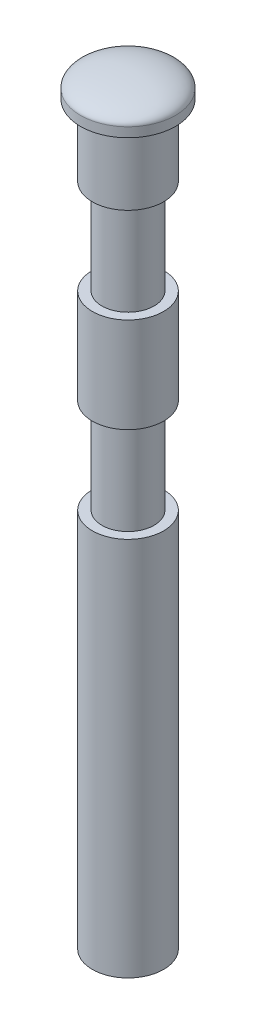
ISO-10303-21;
HEADER;
FILE_DESCRIPTION(('STEP AP214'),'2;1');
FILE_NAME('part.step','',(''),(''),'','','');
FILE_SCHEMA(('AUTOMOTIVE_DESIGN { 1 0 10303 214 1 1 1 1 }'));
ENDSEC;
DATA;
#1=APPLICATION_CONTEXT('core data for automotive mechanical design processes');
#2=APPLICATION_PROTOCOL_DEFINITION('international standard','automotive_design',2000,#1);
#3=PRODUCT_CONTEXT('',#1,'mechanical');
#4=PRODUCT('Part','Part','',(#3));
#5=PRODUCT_RELATED_PRODUCT_CATEGORY('part','',(#4));
#6=PRODUCT_DEFINITION_FORMATION('','',#4);
#7=PRODUCT_DEFINITION_CONTEXT('part definition',#1,'design');
#8=PRODUCT_DEFINITION('design','',#6,#7);
#9=PRODUCT_DEFINITION_SHAPE('','',#8);
#10=(LENGTH_UNIT() NAMED_UNIT(*) SI_UNIT(.MILLI.,.METRE.));
#11=(NAMED_UNIT(*) PLANE_ANGLE_UNIT() SI_UNIT($,.RADIAN.));
#12=(NAMED_UNIT(*) SI_UNIT($,.STERADIAN.) SOLID_ANGLE_UNIT());
#13=UNCERTAINTY_MEASURE_WITH_UNIT(LENGTH_MEASURE(1.E-05),#10,'distance_accuracy_value','');
#14=(GEOMETRIC_REPRESENTATION_CONTEXT(3) GLOBAL_UNCERTAINTY_ASSIGNED_CONTEXT((#13)) GLOBAL_UNIT_ASSIGNED_CONTEXT((#10,
#11,#12)) REPRESENTATION_CONTEXT('',''));
#15=CARTESIAN_POINT('',(0.,0.,0.));
#16=DIRECTION('',(0.,0.,1.));
#17=DIRECTION('',(1.,0.,0.));
#18=AXIS2_PLACEMENT_3D('',#15,#16,#17);
#19=CARTESIAN_POINT('',(0.999999999999998,22.0106613384872,0.));
#20=DIRECTION('',(0.,1.,0.));
#21=DIRECTION('',(-1.,0.,0.));
#22=AXIS2_PLACEMENT_3D('',#19,#20,#21);
#23=CYLINDRICAL_SURFACE('',#22,1.);
#24=CARTESIAN_POINT('',(0.999999999999999,15.7,0.));
#25=DIRECTION('',(0.,1.,0.));
#26=DIRECTION('',(-1.,0.,0.));
#27=AXIS2_PLACEMENT_3D('',#24,#25,#26);
#28=CIRCLE('',#27,1.);
#29=CARTESIAN_POINT('',(0.,15.7,0.));
#30=VERTEX_POINT('',#29);
#31=EDGE_CURVE('E11',#30,#30,#28,.T.);
#32=ORIENTED_EDGE('',*,*,#31,.F.);
#33=EDGE_LOOP('',(#32));
#34=FACE_BOUND('',#33,.T.);
#35=CARTESIAN_POINT('',(0.999999999999999,15.5,0.));
#36=DIRECTION('',(0.,-1.,0.));
#37=DIRECTION('',(1.,0.,0.));
#38=AXIS2_PLACEMENT_3D('',#35,#36,#37);
#39=CIRCLE('',#38,1.);
#40=CARTESIAN_POINT('',(2.,15.5,0.));
#41=VERTEX_POINT('',#40);
#42=EDGE_CURVE('E42',#41,#41,#39,.T.);
#43=ORIENTED_EDGE('',*,*,#42,.F.);
#44=EDGE_LOOP('',(#43));
#45=FACE_BOUND('',#44,.T.);
#46=ADVANCED_FACE('F35',(#34,#45),#23,.T.);
#47=CARTESIAN_POINT('',(1.,15.7,0.));
#48=DIRECTION('',(0.,0.,1.));
#49=DIRECTION('',(1.,0.,0.));
#50=AXIS2_PLACEMENT_3D('',#47,#48,#49);
#51=ELLIPSE('',#50,1.,0.300000000000002);
#52=TRIMMED_CURVE('',#51,(PARAMETER_VALUE(-1.5707963267949)),(PARAMETER_VALUE(1.5707963267949)),
.T.,.PARAMETER.);
#53=CARTESIAN_POINT('',(0.999999999999998,22.0106613384872,0.));
#54=DIRECTION('',(0.,1.,0.));
#55=AXIS1_PLACEMENT('',#53,#54);
#56=SURFACE_OF_REVOLUTION('',#52,#55);
#57=CARTESIAN_POINT('',(0.999999999999999,16.,0.));
#58=VERTEX_POINT('',#57);
#59=VERTEX_LOOP('',#58);
#60=FACE_BOUND('',#59,.T.);
#61=ORIENTED_EDGE('',*,*,#31,.T.);
#62=EDGE_LOOP('',(#61));
#63=FACE_BOUND('',#62,.T.);
#64=ADVANCED_FACE('F46',(#60,#63),#56,.T.);
#65=CARTESIAN_POINT('',(0.999999999999999,15.5,0.));
#66=DIRECTION('',(0.,-1.,0.));
#67=DIRECTION('',(1.,0.,0.));
#68=AXIS2_PLACEMENT_3D('',#65,#66,#67);
#69=PLANE('',#68);
#70=CARTESIAN_POINT('',(0.999999999999999,15.5,0.));
#71=DIRECTION('',(0.,-1.,0.));
#72=DIRECTION('',(1.,0.,0.));
#73=AXIS2_PLACEMENT_3D('',#70,#71,#72);
#74=CIRCLE('',#73,0.75);
#75=CARTESIAN_POINT('',(1.75,15.5,0.));
#76=VERTEX_POINT('',#75);
#77=EDGE_CURVE('E57',#76,#76,#74,.T.);
#78=ORIENTED_EDGE('',*,*,#77,.F.);
#79=EDGE_LOOP('',(#78));
#80=FACE_BOUND('',#79,.T.);
#81=ORIENTED_EDGE('',*,*,#42,.T.);
#82=EDGE_LOOP('',(#81));
#83=FACE_BOUND('',#82,.T.);
#84=ADVANCED_FACE('F49',(#80,#83),#69,.T.);
#85=CARTESIAN_POINT('',(0.999999999999999,15.5,0.));
#86=DIRECTION('',(0.,-1.,0.));
#87=DIRECTION('',(1.,0.,0.));
#88=AXIS2_PLACEMENT_3D('',#85,#86,#87);
#89=CYLINDRICAL_SURFACE('',#88,0.75);
#90=CARTESIAN_POINT('',(0.999999999999999,14.,0.));
#91=DIRECTION('',(0.,1.,0.));
#92=DIRECTION('',(0.,0.,1.));
#93=AXIS2_PLACEMENT_3D('',#90,#91,#92);
#94=CIRCLE('',#93,0.75);
#95=CARTESIAN_POINT('',(0.999999999999999,14.,0.75));
#96=VERTEX_POINT('',#95);
#97=EDGE_CURVE('E70',#96,#96,#94,.F.);
#98=ORIENTED_EDGE('',*,*,#97,.F.);
#99=EDGE_LOOP('',(#98));
#100=FACE_BOUND('',#99,.T.);
#101=ORIENTED_EDGE('',*,*,#77,.T.);
#102=EDGE_LOOP('',(#101));
#103=FACE_BOUND('',#102,.T.);
#104=ADVANCED_FACE('F98',(#100,#103),#89,.T.);
#105=CARTESIAN_POINT('',(1.94346353800707,12.,0.));
#106=DIRECTION('',(0.,-1.,0.));
#107=DIRECTION('',(0.,0.,-1.));
#108=AXIS2_PLACEMENT_3D('',#105,#106,#107);
#109=PLANE('',#108);
#110=CARTESIAN_POINT('',(1.,12.,0.));
#111=DIRECTION('',(0.,-1.,0.));
#112=DIRECTION('',(0.,0.,-1.));
#113=AXIS2_PLACEMENT_3D('',#110,#111,#112);
#114=CIRCLE('',#113,0.75);
#115=CARTESIAN_POINT('',(1.,12.,-0.75));
#116=VERTEX_POINT('',#115);
#117=EDGE_CURVE('E38',#116,#116,#114,.F.);
#118=ORIENTED_EDGE('',*,*,#117,.T.);
#119=EDGE_LOOP('',(#118));
#120=FACE_BOUND('',#119,.T.);
#121=CARTESIAN_POINT('',(1.,12.,0.));
#122=DIRECTION('',(0.,-1.,0.));
#123=DIRECTION('',(0.,0.,-1.));
#124=AXIS2_PLACEMENT_3D('',#121,#122,#123);
#125=CIRCLE('',#124,0.55);
#126=CARTESIAN_POINT('',(1.,12.,-0.55));
#127=VERTEX_POINT('',#126);
#128=EDGE_CURVE('E68',#127,#127,#125,.T.);
#129=ORIENTED_EDGE('',*,*,#128,.T.);
#130=EDGE_LOOP('',(#129));
#131=FACE_BOUND('',#130,.T.);
#132=ADVANCED_FACE('F102',(#120,#131),#109,.F.);
#133=CARTESIAN_POINT('',(1.,0.,0.));
#134=DIRECTION('',(0.,-1.,0.));
#135=DIRECTION('',(0.,0.,-1.));
#136=AXIS2_PLACEMENT_3D('',#133,#134,#135);
#137=CYLINDRICAL_SURFACE('',#136,0.55);
#138=ORIENTED_EDGE('',*,*,#128,.F.);
#139=EDGE_LOOP('',(#138));
#140=FACE_BOUND('',#139,.T.);
#141=CARTESIAN_POINT('',(1.,14.,0.));
#142=DIRECTION('',(0.,-1.,0.));
#143=DIRECTION('',(0.,0.,-1.));
#144=AXIS2_PLACEMENT_3D('',#141,#142,#143);
#145=CIRCLE('',#144,0.55);
#146=CARTESIAN_POINT('',(1.,14.,-0.55));
#147=VERTEX_POINT('',#146);
#148=EDGE_CURVE('E139',#147,#147,#145,.T.);
#149=ORIENTED_EDGE('',*,*,#148,.T.);
#150=EDGE_LOOP('',(#149));
#151=FACE_BOUND('',#150,.T.);
#152=ADVANCED_FACE('F126',(#140,#151),#137,.T.);
#153=CARTESIAN_POINT('',(1.94346353800707,14.,0.));
#154=DIRECTION('',(0.,1.,0.));
#155=DIRECTION('',(0.,0.,1.));
#156=AXIS2_PLACEMENT_3D('',#153,#154,#155);
#157=PLANE('',#156);
#158=ORIENTED_EDGE('',*,*,#97,.T.);
#159=EDGE_LOOP('',(#158));
#160=FACE_BOUND('',#159,.T.);
#161=ORIENTED_EDGE('',*,*,#148,.F.);
#162=EDGE_LOOP('',(#161));
#163=FACE_BOUND('',#162,.T.);
#164=ADVANCED_FACE('F129',(#160,#163),#157,.F.);
#165=ORIENTED_EDGE('',*,*,#117,.F.);
#166=EDGE_LOOP('',(#165));
#167=FACE_BOUND('',#166,.T.);
#168=CARTESIAN_POINT('',(1.,10.,0.));
#169=DIRECTION('',(0.,1.,0.));
#170=DIRECTION('',(0.,0.,1.));
#171=AXIS2_PLACEMENT_3D('',#168,#169,#170);
#172=CIRCLE('',#171,0.75);
#173=CARTESIAN_POINT('',(1.,10.,0.75));
#174=VERTEX_POINT('',#173);
#175=EDGE_CURVE('E64',#174,#174,#172,.F.);
#176=ORIENTED_EDGE('',*,*,#175,.F.);
#177=EDGE_LOOP('',(#176));
#178=FACE_BOUND('',#177,.T.);
#179=ADVANCED_FACE('F104',(#167,#178),#89,.T.);
#180=CARTESIAN_POINT('',(1.94346353800707,8.,0.));
#181=DIRECTION('',(0.,-1.,0.));
#182=DIRECTION('',(0.,0.,-1.));
#183=AXIS2_PLACEMENT_3D('',#180,#181,#182);
#184=PLANE('',#183);
#185=CARTESIAN_POINT('',(1.,8.,0.));
#186=DIRECTION('',(0.,-1.,0.));
#187=DIRECTION('',(0.,0.,-1.));
#188=AXIS2_PLACEMENT_3D('',#185,#186,#187);
#189=CIRCLE('',#188,0.75);
#190=CARTESIAN_POINT('',(1.,8.,-0.75));
#191=VERTEX_POINT('',#190);
#192=EDGE_CURVE('E67',#191,#191,#189,.F.);
#193=ORIENTED_EDGE('',*,*,#192,.T.);
#194=EDGE_LOOP('',(#193));
#195=FACE_BOUND('',#194,.T.);
#196=CARTESIAN_POINT('',(1.,8.,0.));
#197=DIRECTION('',(0.,-1.,0.));
#198=DIRECTION('',(0.,0.,-1.));
#199=AXIS2_PLACEMENT_3D('',#196,#197,#198);
#200=CIRCLE('',#199,0.55);
#201=CARTESIAN_POINT('',(1.,8.,-0.55));
#202=VERTEX_POINT('',#201);
#203=EDGE_CURVE('E141',#202,#202,#200,.T.);
#204=ORIENTED_EDGE('',*,*,#203,.T.);
#205=EDGE_LOOP('',(#204));
#206=FACE_BOUND('',#205,.T.);
#207=ADVANCED_FACE('F113',(#195,#206),#184,.F.);
#208=CARTESIAN_POINT('',(1.,0.,0.));
#209=DIRECTION('',(0.,-1.,0.));
#210=DIRECTION('',(0.,0.,-1.));
#211=AXIS2_PLACEMENT_3D('',#208,#209,#210);
#212=CYLINDRICAL_SURFACE('',#211,0.55);
#213=ORIENTED_EDGE('',*,*,#203,.F.);
#214=EDGE_LOOP('',(#213));
#215=FACE_BOUND('',#214,.T.);
#216=CARTESIAN_POINT('',(1.,10.,0.));
#217=DIRECTION('',(0.,-1.,0.));
#218=DIRECTION('',(0.,0.,-1.));
#219=AXIS2_PLACEMENT_3D('',#216,#217,#218);
#220=CIRCLE('',#219,0.55);
#221=CARTESIAN_POINT('',(1.,10.,-0.55));
#222=VERTEX_POINT('',#221);
#223=EDGE_CURVE('E146',#222,#222,#220,.T.);
#224=ORIENTED_EDGE('',*,*,#223,.T.);
#225=EDGE_LOOP('',(#224));
#226=FACE_BOUND('',#225,.T.);
#227=ADVANCED_FACE('F116',(#215,#226),#212,.T.);
#228=CARTESIAN_POINT('',(1.94346353800707,10.,0.));
#229=DIRECTION('',(0.,1.,0.));
#230=DIRECTION('',(0.,0.,1.));
#231=AXIS2_PLACEMENT_3D('',#228,#229,#230);
#232=PLANE('',#231);
#233=ORIENTED_EDGE('',*,*,#175,.T.);
#234=EDGE_LOOP('',(#233));
#235=FACE_BOUND('',#234,.T.);
#236=ORIENTED_EDGE('',*,*,#223,.F.);
#237=EDGE_LOOP('',(#236));
#238=FACE_BOUND('',#237,.T.);
#239=ADVANCED_FACE('F111',(#235,#238),#232,.F.);
#240=CARTESIAN_POINT('',(1.,4.,0.));
#241=DIRECTION('',(0.,-1.,0.));
#242=DIRECTION('',(1.,0.,0.));
#243=AXIS2_PLACEMENT_3D('',#240,#241,#242);
#244=PLANE('',#243);
#245=CARTESIAN_POINT('',(1.,4.,0.));
#246=DIRECTION('',(0.,-1.,0.));
#247=DIRECTION('',(1.,0.,0.));
#248=AXIS2_PLACEMENT_3D('',#245,#246,#247);
#249=CIRCLE('',#248,0.3);
#250=CARTESIAN_POINT('',(1.3,4.,0.));
#251=VERTEX_POINT('',#250);
#252=EDGE_CURVE('E79',#251,#251,#249,.T.);
#253=ORIENTED_EDGE('',*,*,#252,.T.);
#254=EDGE_LOOP('',(#253));
#255=FACE_BOUND('',#254,.T.);
#256=ADVANCED_FACE('F107',(#255),#244,.T.);
#257=CARTESIAN_POINT('',(1.,4.,0.));
#258=DIRECTION('',(0.,-1.,0.));
#259=DIRECTION('',(1.,0.,0.));
#260=AXIS2_PLACEMENT_3D('',#257,#258,#259);
#261=CYLINDRICAL_SURFACE('',#260,0.3);
#262=ORIENTED_EDGE('',*,*,#252,.F.);
#263=EDGE_LOOP('',(#262));
#264=FACE_BOUND('',#263,.T.);
#265=CARTESIAN_POINT('',(1.,0.,0.));
#266=DIRECTION('',(0.,-1.,0.));
#267=DIRECTION('',(1.,0.,0.));
#268=AXIS2_PLACEMENT_3D('',#265,#266,#267);
#269=CIRCLE('',#268,0.3);
#270=CARTESIAN_POINT('',(1.3,0.,0.));
#271=VERTEX_POINT('',#270);
#272=EDGE_CURVE('E75',#271,#271,#269,.T.);
#273=ORIENTED_EDGE('',*,*,#272,.T.);
#274=EDGE_LOOP('',(#273));
#275=FACE_BOUND('',#274,.T.);
#276=ADVANCED_FACE('F94',(#264,#275),#261,.F.);
#277=CARTESIAN_POINT('',(0.,0.,0.));
#278=DIRECTION('',(0.,1.,0.));
#279=DIRECTION('',(-1.,0.,0.));
#280=AXIS2_PLACEMENT_3D('',#277,#278,#279);
#281=PLANE('',#280);
#282=ORIENTED_EDGE('',*,*,#272,.F.);
#283=EDGE_LOOP('',(#282));
#284=FACE_BOUND('',#283,.T.);
#285=CARTESIAN_POINT('',(1.,0.,0.));
#286=DIRECTION('',(0.,-1.,0.));
#287=DIRECTION('',(1.,0.,0.));
#288=AXIS2_PLACEMENT_3D('',#285,#286,#287);
#289=CIRCLE('',#288,0.75);
#290=CARTESIAN_POINT('',(1.75,0.,0.));
#291=VERTEX_POINT('',#290);
#292=EDGE_CURVE('E60',#291,#291,#289,.T.);
#293=ORIENTED_EDGE('',*,*,#292,.T.);
#294=EDGE_LOOP('',(#293));
#295=FACE_BOUND('',#294,.T.);
#296=ADVANCED_FACE('F90',(#284,#295),#281,.F.);
#297=ORIENTED_EDGE('',*,*,#192,.F.);
#298=EDGE_LOOP('',(#297));
#299=FACE_BOUND('',#298,.T.);
#300=ORIENTED_EDGE('',*,*,#292,.F.);
#301=EDGE_LOOP('',(#300));
#302=FACE_BOUND('',#301,.T.);
#303=ADVANCED_FACE('F93',(#299,#302),#89,.T.);
#304=CLOSED_SHELL('',(#46,#64,#84,#104,#132,#152,#164,#179,#207,#227,#239,#256,#276,#296,#303));
#305=MANIFOLD_SOLID_BREP('B2',#304);
#306=ADVANCED_BREP_SHAPE_REPRESENTATION('',(#18,#305),#14);
#307=SHAPE_DEFINITION_REPRESENTATION(#9,#306);
ENDSEC;
END-ISO-10303-21;
